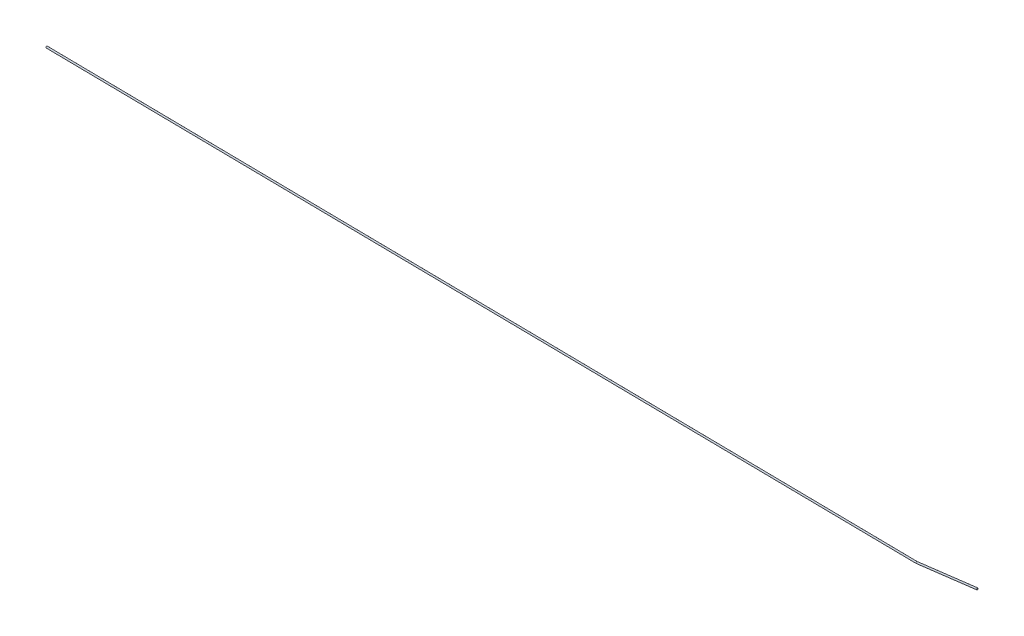
ISO-10303-21;
HEADER;
FILE_DESCRIPTION(('STEP AP214'),'2;1');
FILE_NAME('part.step','',(''),(''),'','','');
FILE_SCHEMA(('AUTOMOTIVE_DESIGN { 1 0 10303 214 1 1 1 1 }'));
ENDSEC;
DATA;
#1=APPLICATION_CONTEXT('core data for automotive mechanical design processes');
#2=APPLICATION_PROTOCOL_DEFINITION('international standard','automotive_design',2000,#1);
#3=PRODUCT_CONTEXT('',#1,'mechanical');
#4=PRODUCT('Part','Part','',(#3));
#5=PRODUCT_RELATED_PRODUCT_CATEGORY('part','',(#4));
#6=PRODUCT_DEFINITION_FORMATION('','',#4);
#7=PRODUCT_DEFINITION_CONTEXT('part definition',#1,'design');
#8=PRODUCT_DEFINITION('design','',#6,#7);
#9=PRODUCT_DEFINITION_SHAPE('','',#8);
#10=(LENGTH_UNIT() NAMED_UNIT(*) SI_UNIT(.MILLI.,.METRE.));
#11=(NAMED_UNIT(*) PLANE_ANGLE_UNIT() SI_UNIT($,.RADIAN.));
#12=(NAMED_UNIT(*) SI_UNIT($,.STERADIAN.) SOLID_ANGLE_UNIT());
#13=UNCERTAINTY_MEASURE_WITH_UNIT(LENGTH_MEASURE(1.E-05),#10,'distance_accuracy_value','');
#14=(GEOMETRIC_REPRESENTATION_CONTEXT(3) GLOBAL_UNCERTAINTY_ASSIGNED_CONTEXT((#13)) GLOBAL_UNIT_ASSIGNED_CONTEXT((#10,
#11,#12)) REPRESENTATION_CONTEXT('',''));
#15=CARTESIAN_POINT('',(0.,0.,0.));
#16=DIRECTION('',(0.,0.,1.));
#17=DIRECTION('',(1.,0.,0.));
#18=AXIS2_PLACEMENT_3D('',#15,#16,#17);
#19=CARTESIAN_POINT('',(365.070334339811,-24.4408687383102,4.65476751938227));
#20=DIRECTION('',(-0.992547235593831,-0.0159916418415743,0.120806674096488));
#21=DIRECTION('',(0.120822124162829,0.,0.992674173287883));
#22=AXIS2_PLACEMENT_3D('',#19,#20,#21);
#23=PLANE('',#22);
#24=CARTESIAN_POINT('',(365.070334339811,-24.4408687383102,4.65476751938227));
#25=DIRECTION('',(-0.992547235593831,-0.0159916418415743,0.120806674096488));
#26=DIRECTION('',(0.120822124162829,0.,0.992674173287883));
#27=AXIS2_PLACEMENT_3D('',#24,#25,#26);
#28=CIRCLE('',#27,0.600000000000002);
#29=CARTESIAN_POINT('',(365.142827614309,-24.4408687383102,5.250372023355));
#30=VERTEX_POINT('',#29);
#31=EDGE_CURVE('E40',#30,#30,#28,.T.);
#32=ORIENTED_EDGE('',*,*,#31,.F.);
#33=EDGE_LOOP('',(#32));
#34=FACE_BOUND('',#33,.T.);
#35=ADVANCED_FACE('F37',(#34),#23,.F.);
#36=CARTESIAN_POINT('',(-340.763210741375,-15.7669005364435,10.2876200493925));
#37=DIRECTION('',(-0.99990082837867,0.0140538419951592,0.000907156449718852));
#38=DIRECTION('',(0.000905606817793364,-0.000116627486103955,0.999999583137074));
#39=AXIS2_PLACEMENT_3D('',#36,#37,#38);
#40=PLANE('',#39);
#41=CARTESIAN_POINT('',(-340.763210741375,-15.7669005364435,10.2876200493925));
#42=DIRECTION('',(-0.99990082837867,0.0140538419951592,0.000907156449718852));
#43=DIRECTION('',(0.000905606817793364,-0.000116627486103955,0.999999583137074));
#44=AXIS2_PLACEMENT_3D('',#41,#42,#43);
#45=CIRCLE('',#44,0.600000000000002);
#46=CARTESIAN_POINT('',(-340.762667377285,-15.7669705129352,10.8876197992747));
#47=VERTEX_POINT('',#46);
#48=EDGE_CURVE('E44',#47,#47,#45,.T.);
#49=ORIENTED_EDGE('',*,*,#48,.T.);
#50=EDGE_LOOP('',(#49));
#51=FACE_BOUND('',#50,.T.);
#52=ADVANCED_FACE('F57',(#51),#40,.T.);
#53=CARTESIAN_POINT('',(323.545519954928,-25.1099048661309,9.70890956765514));
#54=DIRECTION('',(0.992547235593831,0.0159916418415742,-0.120806674096488));
#55=DIRECTION('',(-0.120822124162829,0.,-0.992674173287883));
#56=AXIS2_PLACEMENT_3D('',#53,#54,#55);
#57=CYLINDRICAL_SURFACE('',#56,0.600000000000002);
#58=CARTESIAN_POINT('',(323.744029402047,-25.1067065377626,9.68474823283585));
#59=DIRECTION('',(0.998138889357185,0.000970762260493148,-0.06097388927598));
#60=DIRECTION('',(0.0593868440695945,-0.24264417622992,0.968295929193734));
#61=AXIS2_PLACEMENT_3D('',#58,#59,#60);
#62=ELLIPSE('',#61,0.601153269129908,0.600000000000002);
#63=CARTESIAN_POINT('',(323.779729997502,-25.2525728775386,10.2668424961558));
#64=VERTEX_POINT('',#63);
#65=EDGE_CURVE('E11',#64,#64,#62,.T.);
#66=ORIENTED_EDGE('',*,*,#65,.T.);
#67=EDGE_LOOP('',(#66));
#68=FACE_BOUND('',#67,.T.);
#69=ORIENTED_EDGE('',*,*,#31,.T.);
#70=EDGE_LOOP('',(#69));
#71=FACE_BOUND('',#70,.T.);
#72=ADVANCED_FACE('F54',(#68,#71),#57,.T.);
#73=CARTESIAN_POINT('',(-340.763210741375,-15.7669005364435,10.2876200493925));
#74=DIRECTION('',(0.99990082837867,-0.0140538419951593,-0.000907156449719037));
#75=DIRECTION('',(0.0140538477778468,0.99990123980453,0.));
#76=AXIS2_PLACEMENT_3D('',#73,#74,#75);
#77=CYLINDRICAL_SURFACE('',#76,0.600000000000002);
#78=ORIENTED_EDGE('',*,*,#48,.F.);
#79=EDGE_LOOP('',(#78));
#80=FACE_BOUND('',#79,.T.);
#81=ORIENTED_EDGE('',*,*,#65,.F.);
#82=EDGE_LOOP('',(#81));
#83=FACE_BOUND('',#82,.T.);
#84=ADVANCED_FACE('F61',(#80,#83),#77,.T.);
#85=CLOSED_SHELL('',(#35,#52,#72,#84));
#86=MANIFOLD_SOLID_BREP('B2',#85);
#87=ADVANCED_BREP_SHAPE_REPRESENTATION('',(#18,#86),#14);
#88=SHAPE_DEFINITION_REPRESENTATION(#9,#87);
ENDSEC;
END-ISO-10303-21;
